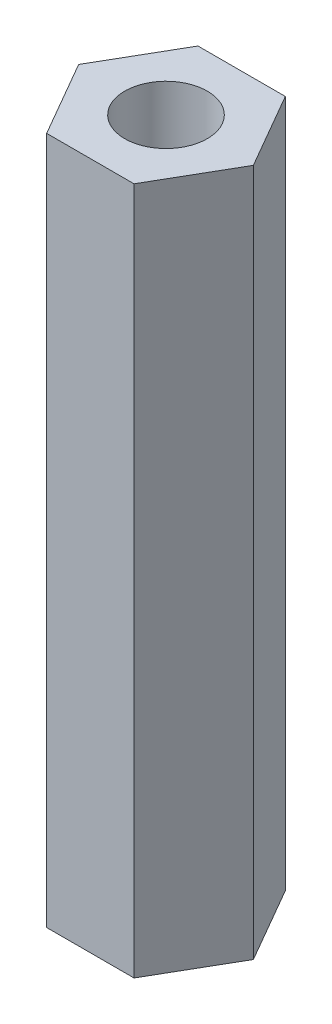
ISO-10303-21;
HEADER;
FILE_DESCRIPTION(('STEP AP214'),'2;1');
FILE_NAME('part.step','',(''),(''),'','','');
FILE_SCHEMA(('AUTOMOTIVE_DESIGN { 1 0 10303 214 1 1 1 1 }'));
ENDSEC;
DATA;
#1=APPLICATION_CONTEXT('core data for automotive mechanical design processes');
#2=APPLICATION_PROTOCOL_DEFINITION('international standard','automotive_design',2000,#1);
#3=PRODUCT_CONTEXT('',#1,'mechanical');
#4=PRODUCT('Part','Part','',(#3));
#5=PRODUCT_RELATED_PRODUCT_CATEGORY('part','',(#4));
#6=PRODUCT_DEFINITION_FORMATION('','',#4);
#7=PRODUCT_DEFINITION_CONTEXT('part definition',#1,'design');
#8=PRODUCT_DEFINITION('design','',#6,#7);
#9=PRODUCT_DEFINITION_SHAPE('','',#8);
#10=(LENGTH_UNIT() NAMED_UNIT(*) SI_UNIT(.MILLI.,.METRE.));
#11=(NAMED_UNIT(*) PLANE_ANGLE_UNIT() SI_UNIT($,.RADIAN.));
#12=(NAMED_UNIT(*) SI_UNIT($,.STERADIAN.) SOLID_ANGLE_UNIT());
#13=UNCERTAINTY_MEASURE_WITH_UNIT(LENGTH_MEASURE(1.E-05),#10,'distance_accuracy_value','');
#14=(GEOMETRIC_REPRESENTATION_CONTEXT(3) GLOBAL_UNCERTAINTY_ASSIGNED_CONTEXT((#13)) GLOBAL_UNIT_ASSIGNED_CONTEXT((#10,
#11,#12)) REPRESENTATION_CONTEXT('',''));
#15=CARTESIAN_POINT('',(0.,0.,0.));
#16=DIRECTION('',(0.,0.,1.));
#17=DIRECTION('',(1.,0.,0.));
#18=AXIS2_PLACEMENT_3D('',#15,#16,#17);
#19=CARTESIAN_POINT('',(1.5877132402715,25.,2.74999999999997));
#20=DIRECTION('',(-0.866025403784442,0.,-0.499999999999995));
#21=DIRECTION('',(-0.499999999999995,0.,0.866025403784442));
#22=AXIS2_PLACEMENT_3D('',#19,#20,#21);
#23=PLANE('',#22);
#24=DIRECTION('',(0.499999999999995,0.,-0.866025403784441));
#25=VECTOR('',#24,1.);
#26=CARTESIAN_POINT('',(1.5877132402715,0.,2.74999999999997));
#27=LINE('',#26,#25);
#28=CARTESIAN_POINT('',(1.5877132402715,0.,2.74999999999997));
#29=VERTEX_POINT('',#28);
#30=CARTESIAN_POINT('',(3.17542648054293,0.,0.));
#31=VERTEX_POINT('',#30);
#32=EDGE_CURVE('E117',#29,#31,#27,.T.);
#33=ORIENTED_EDGE('',*,*,#32,.T.);
#34=DIRECTION('',(0.,-1.,0.));
#35=VECTOR('',#34,1.);
#36=CARTESIAN_POINT('',(3.17542648054293,25.,0.));
#37=LINE('',#36,#35);
#38=CARTESIAN_POINT('',(3.17542648054293,25.,0.));
#39=VERTEX_POINT('',#38);
#40=EDGE_CURVE('E11',#39,#31,#37,.T.);
#41=ORIENTED_EDGE('',*,*,#40,.F.);
#42=DIRECTION('',(0.499999999999995,0.,-0.866025403784441));
#43=VECTOR('',#42,1.);
#44=CARTESIAN_POINT('',(1.5877132402715,25.,2.74999999999997));
#45=LINE('',#44,#43);
#46=CARTESIAN_POINT('',(1.5877132402715,25.,2.74999999999997));
#47=VERTEX_POINT('',#46);
#48=EDGE_CURVE('E128',#47,#39,#45,.T.);
#49=ORIENTED_EDGE('',*,*,#48,.F.);
#50=DIRECTION('',(0.,-1.,0.));
#51=VECTOR('',#50,1.);
#52=CARTESIAN_POINT('',(1.5877132402715,25.,2.74999999999997));
#53=LINE('',#52,#51);
#54=EDGE_CURVE('E113',#47,#29,#53,.T.);
#55=ORIENTED_EDGE('',*,*,#54,.T.);
#56=EDGE_LOOP('',(#33,#41,#49,#55));
#57=FACE_BOUND('',#56,.T.);
#58=ADVANCED_FACE('F33',(#57),#23,.F.);
#59=CARTESIAN_POINT('',(3.17542648054293,25.,0.));
#60=DIRECTION('',(-0.866025403784438,0.,0.500000000000001));
#61=DIRECTION('',(0.500000000000001,0.,0.866025403784438));
#62=AXIS2_PLACEMENT_3D('',#59,#60,#61);
#63=PLANE('',#62);
#64=DIRECTION('',(-0.500000000000001,0.,-0.866025403784438));
#65=VECTOR('',#64,1.);
#66=CARTESIAN_POINT('',(3.17542648054293,0.,0.));
#67=LINE('',#66,#65);
#68=CARTESIAN_POINT('',(1.58771324027146,0.,-2.74999999999999));
#69=VERTEX_POINT('',#68);
#70=EDGE_CURVE('E120',#31,#69,#67,.T.);
#71=ORIENTED_EDGE('',*,*,#70,.T.);
#72=DIRECTION('',(0.,-1.,0.));
#73=VECTOR('',#72,1.);
#74=CARTESIAN_POINT('',(1.58771324027146,25.,-2.74999999999999));
#75=LINE('',#74,#73);
#76=CARTESIAN_POINT('',(1.58771324027146,25.,-2.74999999999999));
#77=VERTEX_POINT('',#76);
#78=EDGE_CURVE('E41',#77,#69,#75,.T.);
#79=ORIENTED_EDGE('',*,*,#78,.F.);
#80=DIRECTION('',(-0.500000000000001,0.,-0.866025403784438));
#81=VECTOR('',#80,1.);
#82=CARTESIAN_POINT('',(3.17542648054293,25.,0.));
#83=LINE('',#82,#81);
#84=EDGE_CURVE('E86',#39,#77,#83,.T.);
#85=ORIENTED_EDGE('',*,*,#84,.F.);
#86=ORIENTED_EDGE('',*,*,#40,.T.);
#87=EDGE_LOOP('',(#71,#79,#85,#86));
#88=FACE_BOUND('',#87,.T.);
#89=ADVANCED_FACE('F153',(#88),#63,.F.);
#90=CARTESIAN_POINT('',(1.58771324027146,25.,-2.74999999999999));
#91=DIRECTION('',(0.,0.,1.));
#92=DIRECTION('',(1.,0.,0.));
#93=AXIS2_PLACEMENT_3D('',#90,#91,#92);
#94=PLANE('',#93);
#95=DIRECTION('',(-1.,0.,0.));
#96=VECTOR('',#95,1.);
#97=CARTESIAN_POINT('',(1.58771324027146,0.,-2.74999999999999));
#98=LINE('',#97,#96);
#99=CARTESIAN_POINT('',(-1.58771324027148,0.,-2.74999999999998));
#100=VERTEX_POINT('',#99);
#101=EDGE_CURVE('E123',#69,#100,#98,.T.);
#102=ORIENTED_EDGE('',*,*,#101,.T.);
#103=DIRECTION('',(0.,-1.,0.));
#104=VECTOR('',#103,1.);
#105=CARTESIAN_POINT('',(-1.58771324027148,25.,-2.74999999999998));
#106=LINE('',#105,#104);
#107=CARTESIAN_POINT('',(-1.58771324027148,25.,-2.74999999999998));
#108=VERTEX_POINT('',#107);
#109=EDGE_CURVE('E108',#108,#100,#106,.T.);
#110=ORIENTED_EDGE('',*,*,#109,.F.);
#111=DIRECTION('',(-1.,0.,0.));
#112=VECTOR('',#111,1.);
#113=CARTESIAN_POINT('',(1.58771324027146,25.,-2.74999999999999));
#114=LINE('',#113,#112);
#115=EDGE_CURVE('E99',#77,#108,#114,.T.);
#116=ORIENTED_EDGE('',*,*,#115,.F.);
#117=ORIENTED_EDGE('',*,*,#78,.T.);
#118=EDGE_LOOP('',(#102,#110,#116,#117));
#119=FACE_BOUND('',#118,.T.);
#120=ADVANCED_FACE('F134',(#119),#94,.F.);
#121=CARTESIAN_POINT('',(-1.58771324027148,25.,-2.74999999999998));
#122=DIRECTION('',(0.866025403784442,0.,0.499999999999995));
#123=DIRECTION('',(0.499999999999995,0.,-0.866025403784442));
#124=AXIS2_PLACEMENT_3D('',#121,#122,#123);
#125=PLANE('',#124);
#126=DIRECTION('',(-0.499999999999995,0.,0.866025403784442));
#127=VECTOR('',#126,1.);
#128=CARTESIAN_POINT('',(-1.58771324027148,0.,-2.74999999999998));
#129=LINE('',#128,#127);
#130=CARTESIAN_POINT('',(-3.17542648054293,0.,0.));
#131=VERTEX_POINT('',#130);
#132=EDGE_CURVE('E107',#100,#131,#129,.T.);
#133=ORIENTED_EDGE('',*,*,#132,.T.);
#134=DIRECTION('',(0.,-1.,0.));
#135=VECTOR('',#134,1.);
#136=CARTESIAN_POINT('',(-3.17542648054293,25.,0.));
#137=LINE('',#136,#135);
#138=CARTESIAN_POINT('',(-3.17542648054293,25.,0.));
#139=VERTEX_POINT('',#138);
#140=EDGE_CURVE('E104',#139,#131,#137,.T.);
#141=ORIENTED_EDGE('',*,*,#140,.F.);
#142=DIRECTION('',(-0.499999999999995,0.,0.866025403784442));
#143=VECTOR('',#142,1.);
#144=CARTESIAN_POINT('',(-1.58771324027148,25.,-2.74999999999998));
#145=LINE('',#144,#143);
#146=EDGE_CURVE('E93',#108,#139,#145,.T.);
#147=ORIENTED_EDGE('',*,*,#146,.F.);
#148=ORIENTED_EDGE('',*,*,#109,.T.);
#149=EDGE_LOOP('',(#133,#141,#147,#148));
#150=FACE_BOUND('',#149,.T.);
#151=ADVANCED_FACE('F105',(#150),#125,.F.);
#152=CARTESIAN_POINT('',(-3.17542648054293,25.,0.));
#153=DIRECTION('',(0.866025403784435,0.,-0.500000000000007));
#154=DIRECTION('',(-0.500000000000007,0.,-0.866025403784435));
#155=AXIS2_PLACEMENT_3D('',#152,#153,#154);
#156=PLANE('',#155);
#157=DIRECTION('',(0.500000000000007,0.,0.866025403784435));
#158=VECTOR('',#157,1.);
#159=CARTESIAN_POINT('',(-3.17542648054293,0.,0.));
#160=LINE('',#159,#158);
#161=CARTESIAN_POINT('',(-1.58771324027144,0.,2.75));
#162=VERTEX_POINT('',#161);
#163=EDGE_CURVE('E72',#131,#162,#160,.T.);
#164=ORIENTED_EDGE('',*,*,#163,.T.);
#165=DIRECTION('',(0.,-1.,0.));
#166=VECTOR('',#165,1.);
#167=CARTESIAN_POINT('',(-1.58771324027144,25.,2.75));
#168=LINE('',#167,#166);
#169=CARTESIAN_POINT('',(-1.58771324027144,25.,2.75));
#170=VERTEX_POINT('',#169);
#171=EDGE_CURVE('E109',#170,#162,#168,.T.);
#172=ORIENTED_EDGE('',*,*,#171,.F.);
#173=DIRECTION('',(0.500000000000007,0.,0.866025403784435));
#174=VECTOR('',#173,1.);
#175=CARTESIAN_POINT('',(-3.17542648054293,25.,0.));
#176=LINE('',#175,#174);
#177=EDGE_CURVE('E97',#139,#170,#176,.T.);
#178=ORIENTED_EDGE('',*,*,#177,.F.);
#179=ORIENTED_EDGE('',*,*,#140,.T.);
#180=EDGE_LOOP('',(#164,#172,#178,#179));
#181=FACE_BOUND('',#180,.T.);
#182=ADVANCED_FACE('F111',(#181),#156,.F.);
#183=CARTESIAN_POINT('',(-1.58771324027144,25.,2.75));
#184=DIRECTION('',(0.,0.,-1.));
#185=DIRECTION('',(-1.,0.,0.));
#186=AXIS2_PLACEMENT_3D('',#183,#184,#185);
#187=PLANE('',#186);
#188=DIRECTION('',(1.,0.,0.));
#189=VECTOR('',#188,1.);
#190=CARTESIAN_POINT('',(-1.58771324027144,0.,2.75));
#191=LINE('',#190,#189);
#192=EDGE_CURVE('E78',#162,#29,#191,.T.);
#193=ORIENTED_EDGE('',*,*,#192,.T.);
#194=ORIENTED_EDGE('',*,*,#54,.F.);
#195=DIRECTION('',(1.,0.,0.));
#196=VECTOR('',#195,1.);
#197=CARTESIAN_POINT('',(-1.58771324027144,25.,2.75));
#198=LINE('',#197,#196);
#199=EDGE_CURVE('E49',#170,#47,#198,.T.);
#200=ORIENTED_EDGE('',*,*,#199,.F.);
#201=ORIENTED_EDGE('',*,*,#171,.T.);
#202=EDGE_LOOP('',(#193,#194,#200,#201));
#203=FACE_BOUND('',#202,.T.);
#204=ADVANCED_FACE('F141',(#203),#187,.F.);
#205=CARTESIAN_POINT('',(0.,25.,0.));
#206=DIRECTION('',(0.,1.,0.));
#207=DIRECTION('',(0.,0.,1.));
#208=AXIS2_PLACEMENT_3D('',#205,#206,#207);
#209=PLANE('',#208);
#210=CARTESIAN_POINT('',(0.,25.,0.));
#211=DIRECTION('',(0.,1.,0.));
#212=DIRECTION('',(0.,0.,1.));
#213=AXIS2_PLACEMENT_3D('',#210,#211,#212);
#214=CIRCLE('',#213,1.5);
#215=CARTESIAN_POINT('',(0.,25.,1.5));
#216=VERTEX_POINT('',#215);
#217=EDGE_CURVE('E236',#216,#216,#214,.T.);
#218=ORIENTED_EDGE('',*,*,#217,.F.);
#219=EDGE_LOOP('',(#218));
#220=FACE_BOUND('',#219,.T.);
#221=ORIENTED_EDGE('',*,*,#48,.T.);
#222=ORIENTED_EDGE('',*,*,#84,.T.);
#223=ORIENTED_EDGE('',*,*,#115,.T.);
#224=ORIENTED_EDGE('',*,*,#146,.T.);
#225=ORIENTED_EDGE('',*,*,#177,.T.);
#226=ORIENTED_EDGE('',*,*,#199,.T.);
#227=EDGE_LOOP('',(#221,#222,#223,#224,#225,#226));
#228=FACE_BOUND('',#227,.T.);
#229=ADVANCED_FACE('F95',(#220,#228),#209,.T.);
#230=CARTESIAN_POINT('',(0.,0.,0.));
#231=DIRECTION('',(0.,1.,0.));
#232=DIRECTION('',(0.,0.,1.));
#233=AXIS2_PLACEMENT_3D('',#230,#231,#232);
#234=PLANE('',#233);
#235=CARTESIAN_POINT('',(0.,0.,0.));
#236=DIRECTION('',(0.,1.,0.));
#237=DIRECTION('',(0.,0.,1.));
#238=AXIS2_PLACEMENT_3D('',#235,#236,#237);
#239=CIRCLE('',#238,1.5);
#240=CARTESIAN_POINT('',(0.,0.,1.5));
#241=VERTEX_POINT('',#240);
#242=EDGE_CURVE('E237',#241,#241,#239,.T.);
#243=ORIENTED_EDGE('',*,*,#242,.T.);
#244=EDGE_LOOP('',(#243));
#245=FACE_BOUND('',#244,.T.);
#246=ORIENTED_EDGE('',*,*,#32,.F.);
#247=ORIENTED_EDGE('',*,*,#192,.F.);
#248=ORIENTED_EDGE('',*,*,#163,.F.);
#249=ORIENTED_EDGE('',*,*,#132,.F.);
#250=ORIENTED_EDGE('',*,*,#101,.F.);
#251=ORIENTED_EDGE('',*,*,#70,.F.);
#252=EDGE_LOOP('',(#246,#247,#248,#249,#250,#251));
#253=FACE_BOUND('',#252,.T.);
#254=ADVANCED_FACE('F137',(#245,#253),#234,.F.);
#255=CARTESIAN_POINT('',(0.,15.,0.));
#256=DIRECTION('',(0.,1.,0.));
#257=DIRECTION('',(0.,0.,1.));
#258=AXIS2_PLACEMENT_3D('',#255,#256,#257);
#259=CYLINDRICAL_SURFACE('',#258,1.5);
#260=CARTESIAN_POINT('',(0.,15.,0.));
#261=DIRECTION('',(0.,1.,0.));
#262=DIRECTION('',(0.,0.,1.));
#263=AXIS2_PLACEMENT_3D('',#260,#261,#262);
#264=CIRCLE('',#263,1.5);
#265=CARTESIAN_POINT('',(0.,15.,1.5));
#266=VERTEX_POINT('',#265);
#267=EDGE_CURVE('E121',#266,#266,#264,.T.);
#268=ORIENTED_EDGE('',*,*,#267,.F.);
#269=EDGE_LOOP('',(#268));
#270=FACE_BOUND('',#269,.T.);
#271=ORIENTED_EDGE('',*,*,#217,.T.);
#272=EDGE_LOOP('',(#271));
#273=FACE_BOUND('',#272,.T.);
#274=ADVANCED_FACE('F188',(#270,#273),#259,.F.);
#275=CARTESIAN_POINT('',(0.,15.,0.));
#276=DIRECTION('',(0.,1.,0.));
#277=DIRECTION('',(0.,0.,1.));
#278=AXIS2_PLACEMENT_3D('',#275,#276,#277);
#279=PLANE('',#278);
#280=ORIENTED_EDGE('',*,*,#267,.T.);
#281=EDGE_LOOP('',(#280));
#282=FACE_BOUND('',#281,.T.);
#283=ADVANCED_FACE('F193',(#282),#279,.T.);
#284=CARTESIAN_POINT('',(0.,10.,0.));
#285=DIRECTION('',(0.,-1.,0.));
#286=DIRECTION('',(0.,0.,-1.));
#287=AXIS2_PLACEMENT_3D('',#284,#285,#286);
#288=CYLINDRICAL_SURFACE('',#287,1.5);
#289=CARTESIAN_POINT('',(0.,10.,0.));
#290=DIRECTION('',(0.,1.,0.));
#291=DIRECTION('',(0.,0.,1.));
#292=AXIS2_PLACEMENT_3D('',#289,#290,#291);
#293=CIRCLE('',#292,1.5);
#294=CARTESIAN_POINT('',(0.,10.,1.5));
#295=VERTEX_POINT('',#294);
#296=EDGE_CURVE('E235',#295,#295,#293,.T.);
#297=ORIENTED_EDGE('',*,*,#296,.T.);
#298=EDGE_LOOP('',(#297));
#299=FACE_BOUND('',#298,.T.);
#300=ORIENTED_EDGE('',*,*,#242,.F.);
#301=EDGE_LOOP('',(#300));
#302=FACE_BOUND('',#301,.T.);
#303=ADVANCED_FACE('F203',(#299,#302),#288,.F.);
#304=CARTESIAN_POINT('',(0.,10.,0.));
#305=DIRECTION('',(0.,-1.,0.));
#306=DIRECTION('',(0.,0.,1.));
#307=AXIS2_PLACEMENT_3D('',#304,#305,#306);
#308=PLANE('',#307);
#309=ORIENTED_EDGE('',*,*,#296,.F.);
#310=EDGE_LOOP('',(#309));
#311=FACE_BOUND('',#310,.T.);
#312=ADVANCED_FACE('F219',(#311),#308,.T.);
#313=CLOSED_SHELL('',(#58,#89,#120,#151,#182,#204,#229,#254,#274,#283,#303,#312));
#314=MANIFOLD_SOLID_BREP('B2',#313);
#315=ADVANCED_BREP_SHAPE_REPRESENTATION('',(#18,#314),#14);
#316=SHAPE_DEFINITION_REPRESENTATION(#9,#315);
ENDSEC;
END-ISO-10303-21;
